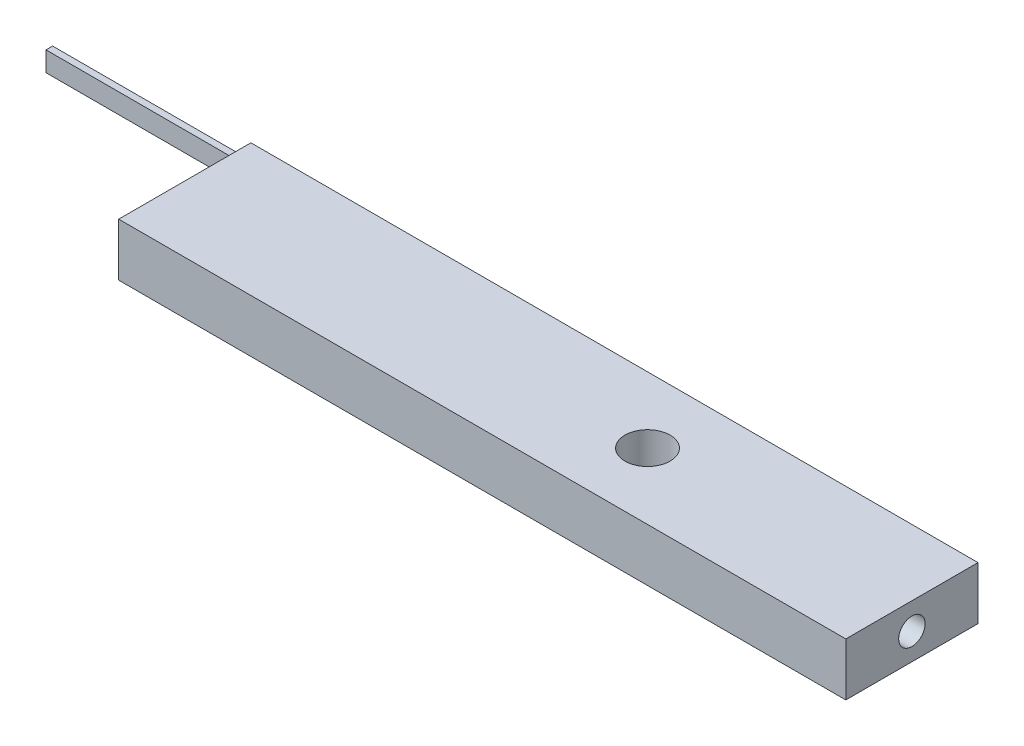
ISO-10303-21;
HEADER;
FILE_DESCRIPTION(('STEP AP214'),'2;1');
FILE_NAME('part.step','',(''),(''),'','','');
FILE_SCHEMA(('AUTOMOTIVE_DESIGN { 1 0 10303 214 1 1 1 1 }'));
ENDSEC;
DATA;
#1=APPLICATION_CONTEXT('core data for automotive mechanical design processes');
#2=APPLICATION_PROTOCOL_DEFINITION('international standard','automotive_design',2000,#1);
#3=PRODUCT_CONTEXT('',#1,'mechanical');
#4=PRODUCT('Part','Part','',(#3));
#5=PRODUCT_RELATED_PRODUCT_CATEGORY('part','',(#4));
#6=PRODUCT_DEFINITION_FORMATION('','',#4);
#7=PRODUCT_DEFINITION_CONTEXT('part definition',#1,'design');
#8=PRODUCT_DEFINITION('design','',#6,#7);
#9=PRODUCT_DEFINITION_SHAPE('','',#8);
#10=(LENGTH_UNIT() NAMED_UNIT(*) SI_UNIT(.MILLI.,.METRE.));
#11=(NAMED_UNIT(*) PLANE_ANGLE_UNIT() SI_UNIT($,.RADIAN.));
#12=(NAMED_UNIT(*) SI_UNIT($,.STERADIAN.) SOLID_ANGLE_UNIT());
#13=UNCERTAINTY_MEASURE_WITH_UNIT(LENGTH_MEASURE(1.E-05),#10,'distance_accuracy_value','');
#14=(GEOMETRIC_REPRESENTATION_CONTEXT(3) GLOBAL_UNCERTAINTY_ASSIGNED_CONTEXT((#13)) GLOBAL_UNIT_ASSIGNED_CONTEXT((#10,
#11,#12)) REPRESENTATION_CONTEXT('',''));
#15=CARTESIAN_POINT('',(0.,0.,0.));
#16=DIRECTION('',(0.,0.,1.));
#17=DIRECTION('',(1.,0.,0.));
#18=AXIS2_PLACEMENT_3D('',#15,#16,#17);
#19=CARTESIAN_POINT('',(-431.408850848024,28.4017175603708,-29.9339561539099));
#20=DIRECTION('',(1.,0.,0.));
#21=DIRECTION('',(0.,0.,-1.));
#22=AXIS2_PLACEMENT_3D('',#19,#20,#21);
#23=PLANE('',#22);
#24=DIRECTION('',(0.,-1.,0.));
#25=VECTOR('',#24,1.);
#26=CARTESIAN_POINT('',(-431.408850848024,28.4017175603708,-34.9339561539099));
#27=LINE('',#26,#25);
#28=CARTESIAN_POINT('',(-431.408850848024,28.4017175603708,-34.9339561539099));
#29=VERTEX_POINT('',#28);
#30=CARTESIAN_POINT('',(-431.408850848024,13.4017175603708,-34.9339561539099));
#31=VERTEX_POINT('',#30);
#32=EDGE_CURVE('E107',#29,#31,#27,.T.);
#33=ORIENTED_EDGE('',*,*,#32,.F.);
#34=DIRECTION('',(0.,0.,-1.));
#35=VECTOR('',#34,1.);
#36=CARTESIAN_POINT('',(-431.408850848024,28.4017175603708,-29.9339561539099));
#37=LINE('',#36,#35);
#38=CARTESIAN_POINT('',(-431.408850848024,28.4017175603708,-29.9339561539099));
#39=VERTEX_POINT('',#38);
#40=EDGE_CURVE('E12',#39,#29,#37,.T.);
#41=ORIENTED_EDGE('',*,*,#40,.F.);
#42=DIRECTION('',(0.,-1.,0.));
#43=VECTOR('',#42,1.);
#44=CARTESIAN_POINT('',(-431.408850848024,28.4017175603708,-29.9339561539099));
#45=LINE('',#44,#43);
#46=CARTESIAN_POINT('',(-431.408850848024,13.4017175603708,-29.9339561539099));
#47=VERTEX_POINT('',#46);
#48=EDGE_CURVE('E101',#39,#47,#45,.T.);
#49=ORIENTED_EDGE('',*,*,#48,.T.);
#50=DIRECTION('',(0.,0.,-1.));
#51=VECTOR('',#50,1.);
#52=CARTESIAN_POINT('',(-431.408850848024,13.4017175603708,-29.9339561539099));
#53=LINE('',#52,#51);
#54=EDGE_CURVE('E46',#47,#31,#53,.T.);
#55=ORIENTED_EDGE('',*,*,#54,.T.);
#56=EDGE_LOOP('',(#33,#41,#49,#55));
#57=FACE_BOUND('',#56,.T.);
#58=ADVANCED_FACE('F43',(#57),#23,.T.);
#59=CARTESIAN_POINT('',(-431.408850848024,28.4017175603708,-29.9339561539099));
#60=DIRECTION('',(0.,1.,0.));
#61=DIRECTION('',(0.,0.,1.));
#62=AXIS2_PLACEMENT_3D('',#59,#60,#61);
#63=PLANE('',#62);
#64=DIRECTION('',(1.,0.,0.));
#65=VECTOR('',#64,1.);
#66=CARTESIAN_POINT('',(-431.408850848024,28.4017175603708,-34.9339561539099));
#67=LINE('',#66,#65);
#68=CARTESIAN_POINT('',(-581.408850848024,28.4017175603708,-34.9339561539099));
#69=VERTEX_POINT('',#68);
#70=EDGE_CURVE('E103',#69,#29,#67,.T.);
#71=ORIENTED_EDGE('',*,*,#70,.F.);
#72=DIRECTION('',(0.,0.,-1.));
#73=VECTOR('',#72,1.);
#74=CARTESIAN_POINT('',(-581.408850848024,28.4017175603708,-29.9339561539099));
#75=LINE('',#74,#73);
#76=CARTESIAN_POINT('',(-581.408850848024,28.4017175603708,-29.9339561539099));
#77=VERTEX_POINT('',#76);
#78=EDGE_CURVE('E52',#77,#69,#75,.T.);
#79=ORIENTED_EDGE('',*,*,#78,.F.);
#80=DIRECTION('',(1.,0.,0.));
#81=VECTOR('',#80,1.);
#82=CARTESIAN_POINT('',(-431.408850848024,28.4017175603708,-29.9339561539099));
#83=LINE('',#82,#81);
#84=EDGE_CURVE('E98',#77,#39,#83,.T.);
#85=ORIENTED_EDGE('',*,*,#84,.T.);
#86=ORIENTED_EDGE('',*,*,#40,.T.);
#87=EDGE_LOOP('',(#71,#79,#85,#86));
#88=FACE_BOUND('',#87,.T.);
#89=ADVANCED_FACE('F117',(#88),#63,.T.);
#90=CARTESIAN_POINT('',(-581.408850848024,28.4017175603708,-29.9339561539099));
#91=DIRECTION('',(-1.,0.,0.));
#92=DIRECTION('',(0.,0.,1.));
#93=AXIS2_PLACEMENT_3D('',#90,#91,#92);
#94=PLANE('',#93);
#95=DIRECTION('',(0.,1.,0.));
#96=VECTOR('',#95,1.);
#97=CARTESIAN_POINT('',(-581.408850848024,28.4017175603708,-34.9339561539099));
#98=LINE('',#97,#96);
#99=CARTESIAN_POINT('',(-581.408850848024,13.4017175603708,-34.9339561539099));
#100=VERTEX_POINT('',#99);
#101=EDGE_CURVE('E93',#100,#69,#98,.T.);
#102=ORIENTED_EDGE('',*,*,#101,.F.);
#103=DIRECTION('',(0.,0.,-1.));
#104=VECTOR('',#103,1.);
#105=CARTESIAN_POINT('',(-581.408850848024,13.4017175603708,-29.9339561539099));
#106=LINE('',#105,#104);
#107=CARTESIAN_POINT('',(-581.408850848024,13.4017175603708,-29.9339561539099));
#108=VERTEX_POINT('',#107);
#109=EDGE_CURVE('E88',#108,#100,#106,.T.);
#110=ORIENTED_EDGE('',*,*,#109,.F.);
#111=DIRECTION('',(0.,1.,0.));
#112=VECTOR('',#111,1.);
#113=CARTESIAN_POINT('',(-581.408850848024,28.4017175603708,-29.9339561539099));
#114=LINE('',#113,#112);
#115=EDGE_CURVE('E91',#108,#77,#114,.T.);
#116=ORIENTED_EDGE('',*,*,#115,.T.);
#117=ORIENTED_EDGE('',*,*,#78,.T.);
#118=EDGE_LOOP('',(#102,#110,#116,#117));
#119=FACE_BOUND('',#118,.T.);
#120=ADVANCED_FACE('F90',(#119),#94,.T.);
#121=CARTESIAN_POINT('',(-431.408850848024,13.4017175603708,-29.9339561539099));
#122=DIRECTION('',(0.,-1.,0.));
#123=DIRECTION('',(0.,0.,-1.));
#124=AXIS2_PLACEMENT_3D('',#121,#122,#123);
#125=PLANE('',#124);
#126=DIRECTION('',(-1.,0.,0.));
#127=VECTOR('',#126,1.);
#128=CARTESIAN_POINT('',(-431.408850848024,13.4017175603708,-34.9339561539099));
#129=LINE('',#128,#127);
#130=EDGE_CURVE('E110',#31,#100,#129,.T.);
#131=ORIENTED_EDGE('',*,*,#130,.F.);
#132=ORIENTED_EDGE('',*,*,#54,.F.);
#133=DIRECTION('',(-1.,0.,0.));
#134=VECTOR('',#133,1.);
#135=CARTESIAN_POINT('',(-431.408850848024,13.4017175603708,-29.9339561539099));
#136=LINE('',#135,#134);
#137=EDGE_CURVE('E97',#47,#108,#136,.T.);
#138=ORIENTED_EDGE('',*,*,#137,.T.);
#139=ORIENTED_EDGE('',*,*,#109,.T.);
#140=EDGE_LOOP('',(#131,#132,#138,#139));
#141=FACE_BOUND('',#140,.T.);
#142=ADVANCED_FACE('F100',(#141),#125,.T.);
#143=CARTESIAN_POINT('',(0.,0.,-29.9339561539099));
#144=DIRECTION('',(0.,0.,-1.));
#145=DIRECTION('',(-1.,0.,0.));
#146=AXIS2_PLACEMENT_3D('',#143,#144,#145);
#147=PLANE('',#146);
#148=ORIENTED_EDGE('',*,*,#48,.F.);
#149=ORIENTED_EDGE('',*,*,#84,.F.);
#150=ORIENTED_EDGE('',*,*,#115,.F.);
#151=ORIENTED_EDGE('',*,*,#137,.F.);
#152=EDGE_LOOP('',(#148,#149,#150,#151));
#153=FACE_BOUND('',#152,.T.);
#154=ADVANCED_FACE('F96',(#153),#147,.F.);
#155=CARTESIAN_POINT('',(0.,0.,-34.9339561539099));
#156=DIRECTION('',(0.,0.,-1.));
#157=DIRECTION('',(-1.,0.,0.));
#158=AXIS2_PLACEMENT_3D('',#155,#156,#157);
#159=PLANE('',#158);
#160=ORIENTED_EDGE('',*,*,#32,.T.);
#161=ORIENTED_EDGE('',*,*,#130,.T.);
#162=ORIENTED_EDGE('',*,*,#101,.T.);
#163=ORIENTED_EDGE('',*,*,#70,.T.);
#164=EDGE_LOOP('',(#160,#161,#162,#163));
#165=FACE_BOUND('',#164,.T.);
#166=ADVANCED_FACE('F116',(#165),#159,.T.);
#167=CLOSED_SHELL('',(#58,#89,#120,#142,#154,#166));
#168=MANIFOLD_SOLID_BREP('B2',#167);
#169=CARTESIAN_POINT('',(0.,40.,0.));
#170=DIRECTION('',(0.,1.,0.));
#171=DIRECTION('',(0.,0.,1.));
#172=AXIS2_PLACEMENT_3D('',#169,#170,#171);
#173=PLANE('',#172);
#174=DIRECTION('',(0.,0.,1.));
#175=VECTOR('',#174,1.);
#176=CARTESIAN_POINT('',(-431.408850848024,40.,-34.9339561539099));
#177=LINE('',#176,#175);
#178=CARTESIAN_POINT('',(-431.408850848024,40.,-34.9339561539099));
#179=VERTEX_POINT('',#178);
#180=CARTESIAN_POINT('',(-431.408850848024,40.,65.0660438460901));
#181=VERTEX_POINT('',#180);
#182=EDGE_CURVE('E218',#179,#181,#177,.T.);
#183=ORIENTED_EDGE('',*,*,#182,.T.);
#184=DIRECTION('',(1.,0.,0.));
#185=VECTOR('',#184,1.);
#186=CARTESIAN_POINT('',(-431.408850848024,40.,65.0660438460901));
#187=LINE('',#186,#185);
#188=CARTESIAN_POINT('',(118.591149151976,40.,65.0660438460901));
#189=VERTEX_POINT('',#188);
#190=EDGE_CURVE('E213',#181,#189,#187,.T.);
#191=ORIENTED_EDGE('',*,*,#190,.T.);
#192=DIRECTION('',(0.,0.,-1.));
#193=VECTOR('',#192,1.);
#194=CARTESIAN_POINT('',(118.591149151976,40.,-34.9339561539099));
#195=LINE('',#194,#193);
#196=CARTESIAN_POINT('',(118.591149151976,40.,-34.9339561539099));
#197=VERTEX_POINT('',#196);
#198=EDGE_CURVE('E216',#189,#197,#195,.T.);
#199=ORIENTED_EDGE('',*,*,#198,.T.);
#200=DIRECTION('',(-1.,0.,0.));
#201=VECTOR('',#200,1.);
#202=CARTESIAN_POINT('',(-431.408850848024,40.,-34.9339561539099));
#203=LINE('',#202,#201);
#204=EDGE_CURVE('E183',#197,#179,#203,.T.);
#205=ORIENTED_EDGE('',*,*,#204,.T.);
#206=EDGE_LOOP('',(#183,#191,#199,#205));
#207=FACE_BOUND('',#206,.T.);
#208=CARTESIAN_POINT('',(-81.4088508480237,40.,15.0660438460901));
#209=DIRECTION('',(0.,1.,0.));
#210=DIRECTION('',(0.,0.,1.));
#211=AXIS2_PLACEMENT_3D('',#208,#209,#210);
#212=CIRCLE('',#211,17.0840294220096);
#213=CARTESIAN_POINT('',(-81.4088508480237,40.,32.1500732680997));
#214=VERTEX_POINT('',#213);
#215=EDGE_CURVE('E233',#214,#214,#212,.T.);
#216=ORIENTED_EDGE('',*,*,#215,.F.);
#217=EDGE_LOOP('',(#216));
#218=FACE_BOUND('',#217,.T.);
#219=ADVANCED_FACE('F166',(#207,#218),#173,.T.);
#220=CARTESIAN_POINT('',(0.,0.,0.));
#221=DIRECTION('',(0.,1.,0.));
#222=DIRECTION('',(0.,0.,1.));
#223=AXIS2_PLACEMENT_3D('',#220,#221,#222);
#224=PLANE('',#223);
#225=DIRECTION('',(0.,0.,1.));
#226=VECTOR('',#225,1.);
#227=CARTESIAN_POINT('',(-431.408850848024,0.,-34.9339561539099));
#228=LINE('',#227,#226);
#229=CARTESIAN_POINT('',(-431.408850848024,0.,-34.9339561539099));
#230=VERTEX_POINT('',#229);
#231=CARTESIAN_POINT('',(-431.408850848024,0.,65.0660438460901));
#232=VERTEX_POINT('',#231);
#233=EDGE_CURVE('E230',#230,#232,#228,.T.);
#234=ORIENTED_EDGE('',*,*,#233,.F.);
#235=DIRECTION('',(-1.,0.,0.));
#236=VECTOR('',#235,1.);
#237=CARTESIAN_POINT('',(-431.408850848024,0.,-34.9339561539099));
#238=LINE('',#237,#236);
#239=CARTESIAN_POINT('',(118.591149151976,0.,-34.9339561539099));
#240=VERTEX_POINT('',#239);
#241=EDGE_CURVE('E206',#240,#230,#238,.T.);
#242=ORIENTED_EDGE('',*,*,#241,.F.);
#243=DIRECTION('',(0.,0.,-1.));
#244=VECTOR('',#243,1.);
#245=CARTESIAN_POINT('',(118.591149151976,0.,-34.9339561539099));
#246=LINE('',#245,#244);
#247=CARTESIAN_POINT('',(118.591149151976,0.,65.0660438460901));
#248=VERTEX_POINT('',#247);
#249=EDGE_CURVE('E200',#248,#240,#246,.T.);
#250=ORIENTED_EDGE('',*,*,#249,.F.);
#251=DIRECTION('',(1.,0.,0.));
#252=VECTOR('',#251,1.);
#253=CARTESIAN_POINT('',(-431.408850848024,0.,65.0660438460901));
#254=LINE('',#253,#252);
#255=EDGE_CURVE('E222',#232,#248,#254,.T.);
#256=ORIENTED_EDGE('',*,*,#255,.F.);
#257=EDGE_LOOP('',(#234,#242,#250,#256));
#258=FACE_BOUND('',#257,.T.);
#259=CARTESIAN_POINT('',(-81.4088508480237,0.,15.0660438460901));
#260=DIRECTION('',(0.,1.,0.));
#261=DIRECTION('',(0.,0.,1.));
#262=AXIS2_PLACEMENT_3D('',#259,#260,#261);
#263=CIRCLE('',#262,17.0840294220096);
#264=CARTESIAN_POINT('',(-81.4088508480237,0.,32.1500732680997));
#265=VERTEX_POINT('',#264);
#266=EDGE_CURVE('E245',#265,#265,#263,.T.);
#267=ORIENTED_EDGE('',*,*,#266,.T.);
#268=EDGE_LOOP('',(#267));
#269=FACE_BOUND('',#268,.T.);
#270=ADVANCED_FACE('F241',(#258,#269),#224,.F.);
#271=CARTESIAN_POINT('',(-431.408850848024,40.,-34.9339561539099));
#272=DIRECTION('',(1.,0.,0.));
#273=DIRECTION('',(0.,0.,-1.));
#274=AXIS2_PLACEMENT_3D('',#271,#272,#273);
#275=PLANE('',#274);
#276=ORIENTED_EDGE('',*,*,#233,.T.);
#277=DIRECTION('',(0.,-1.,0.));
#278=VECTOR('',#277,1.);
#279=CARTESIAN_POINT('',(-431.408850848024,40.,65.0660438460901));
#280=LINE('',#279,#278);
#281=EDGE_CURVE('E41',#181,#232,#280,.T.);
#282=ORIENTED_EDGE('',*,*,#281,.F.);
#283=ORIENTED_EDGE('',*,*,#182,.F.);
#284=DIRECTION('',(0.,-1.,0.));
#285=VECTOR('',#284,1.);
#286=CARTESIAN_POINT('',(-431.408850848024,40.,-34.9339561539099));
#287=LINE('',#286,#285);
#288=EDGE_CURVE('E226',#179,#230,#287,.T.);
#289=ORIENTED_EDGE('',*,*,#288,.T.);
#290=EDGE_LOOP('',(#276,#282,#283,#289));
#291=FACE_BOUND('',#290,.T.);
#292=ADVANCED_FACE('F168',(#291),#275,.F.);
#293=CARTESIAN_POINT('',(-431.408850848024,40.,65.0660438460901));
#294=DIRECTION('',(0.,0.,-1.));
#295=DIRECTION('',(-1.,0.,0.));
#296=AXIS2_PLACEMENT_3D('',#293,#294,#295);
#297=PLANE('',#296);
#298=ORIENTED_EDGE('',*,*,#255,.T.);
#299=DIRECTION('',(0.,-1.,0.));
#300=VECTOR('',#299,1.);
#301=CARTESIAN_POINT('',(118.591149151976,40.,65.0660438460901));
#302=LINE('',#301,#300);
#303=EDGE_CURVE('E175',#189,#248,#302,.T.);
#304=ORIENTED_EDGE('',*,*,#303,.F.);
#305=ORIENTED_EDGE('',*,*,#190,.F.);
#306=ORIENTED_EDGE('',*,*,#281,.T.);
#307=EDGE_LOOP('',(#298,#304,#305,#306));
#308=FACE_BOUND('',#307,.T.);
#309=ADVANCED_FACE('F221',(#308),#297,.F.);
#310=CARTESIAN_POINT('',(118.591149151976,40.,-34.9339561539099));
#311=DIRECTION('',(-1.,0.,0.));
#312=DIRECTION('',(0.,0.,1.));
#313=AXIS2_PLACEMENT_3D('',#310,#311,#312);
#314=PLANE('',#313);
#315=CARTESIAN_POINT('',(118.591149151976,20.,15.06604384609));
#316=DIRECTION('',(1.,0.,0.));
#317=DIRECTION('',(0.,0.,-1.));
#318=AXIS2_PLACEMENT_3D('',#315,#316,#317);
#319=CIRCLE('',#318,10.);
#320=CARTESIAN_POINT('',(118.591149151976,20.,5.06604384609003));
#321=VERTEX_POINT('',#320);
#322=EDGE_CURVE('E251',#321,#321,#319,.T.);
#323=ORIENTED_EDGE('',*,*,#322,.F.);
#324=EDGE_LOOP('',(#323));
#325=FACE_BOUND('',#324,.T.);
#326=ORIENTED_EDGE('',*,*,#249,.T.);
#327=DIRECTION('',(0.,-1.,0.));
#328=VECTOR('',#327,1.);
#329=CARTESIAN_POINT('',(118.591149151976,40.,-34.9339561539099));
#330=LINE('',#329,#328);
#331=EDGE_CURVE('E223',#197,#240,#330,.T.);
#332=ORIENTED_EDGE('',*,*,#331,.F.);
#333=ORIENTED_EDGE('',*,*,#198,.F.);
#334=ORIENTED_EDGE('',*,*,#303,.T.);
#335=EDGE_LOOP('',(#326,#332,#333,#334));
#336=FACE_BOUND('',#335,.T.);
#337=ADVANCED_FACE('F224',(#325,#336),#314,.F.);
#338=CARTESIAN_POINT('',(-431.408850848024,40.,-34.9339561539099));
#339=DIRECTION('',(0.,0.,1.));
#340=DIRECTION('',(1.,0.,0.));
#341=AXIS2_PLACEMENT_3D('',#338,#339,#340);
#342=PLANE('',#341);
#343=ORIENTED_EDGE('',*,*,#241,.T.);
#344=ORIENTED_EDGE('',*,*,#288,.F.);
#345=ORIENTED_EDGE('',*,*,#204,.F.);
#346=ORIENTED_EDGE('',*,*,#331,.T.);
#347=EDGE_LOOP('',(#343,#344,#345,#346));
#348=FACE_BOUND('',#347,.T.);
#349=ADVANCED_FACE('F238',(#348),#342,.F.);
#350=CARTESIAN_POINT('',(-81.4088508480237,40.,15.0660438460901));
#351=DIRECTION('',(0.,-1.,0.));
#352=DIRECTION('',(0.,0.,-1.));
#353=AXIS2_PLACEMENT_3D('',#350,#351,#352);
#354=CYLINDRICAL_SURFACE('',#353,17.0840294220096);
#355=ORIENTED_EDGE('',*,*,#215,.T.);
#356=EDGE_LOOP('',(#355));
#357=FACE_BOUND('',#356,.T.);
#358=ORIENTED_EDGE('',*,*,#266,.F.);
#359=EDGE_LOOP('',(#358));
#360=FACE_BOUND('',#359,.T.);
#361=ADVANCED_FACE('F262',(#357,#360),#354,.F.);
#362=CARTESIAN_POINT('',(4.59114915197621,20.,15.06604384609));
#363=DIRECTION('',(1.,0.,0.));
#364=DIRECTION('',(0.,0.,-1.));
#365=AXIS2_PLACEMENT_3D('',#362,#363,#364);
#366=CYLINDRICAL_SURFACE('',#365,10.);
#367=CARTESIAN_POINT('',(4.59114915197621,20.,15.06604384609));
#368=DIRECTION('',(1.,0.,0.));
#369=DIRECTION('',(0.,0.,-1.));
#370=AXIS2_PLACEMENT_3D('',#367,#368,#369);
#371=CIRCLE('',#370,10.);
#372=CARTESIAN_POINT('',(4.59114915197621,20.,5.06604384609003));
#373=VERTEX_POINT('',#372);
#374=EDGE_CURVE('E248',#373,#373,#371,.T.);
#375=ORIENTED_EDGE('',*,*,#374,.F.);
#376=EDGE_LOOP('',(#375));
#377=FACE_BOUND('',#376,.T.);
#378=ORIENTED_EDGE('',*,*,#322,.T.);
#379=EDGE_LOOP('',(#378));
#380=FACE_BOUND('',#379,.T.);
#381=ADVANCED_FACE('F259',(#377,#380),#366,.F.);
#382=CARTESIAN_POINT('',(4.59114915197621,20.,15.06604384609));
#383=DIRECTION('',(1.,0.,0.));
#384=DIRECTION('',(0.,0.,-1.));
#385=AXIS2_PLACEMENT_3D('',#382,#383,#384);
#386=PLANE('',#385);
#387=ORIENTED_EDGE('',*,*,#374,.T.);
#388=EDGE_LOOP('',(#387));
#389=FACE_BOUND('',#388,.T.);
#390=ADVANCED_FACE('F257',(#389),#386,.T.);
#391=CLOSED_SHELL('',(#219,#270,#292,#309,#337,#349,#361,#381,#390));
#392=MANIFOLD_SOLID_BREP('B6',#391);
#393=ADVANCED_BREP_SHAPE_REPRESENTATION('',(#18,#168,#392),#14);
#394=SHAPE_DEFINITION_REPRESENTATION(#9,#393);
ENDSEC;
END-ISO-10303-21;
